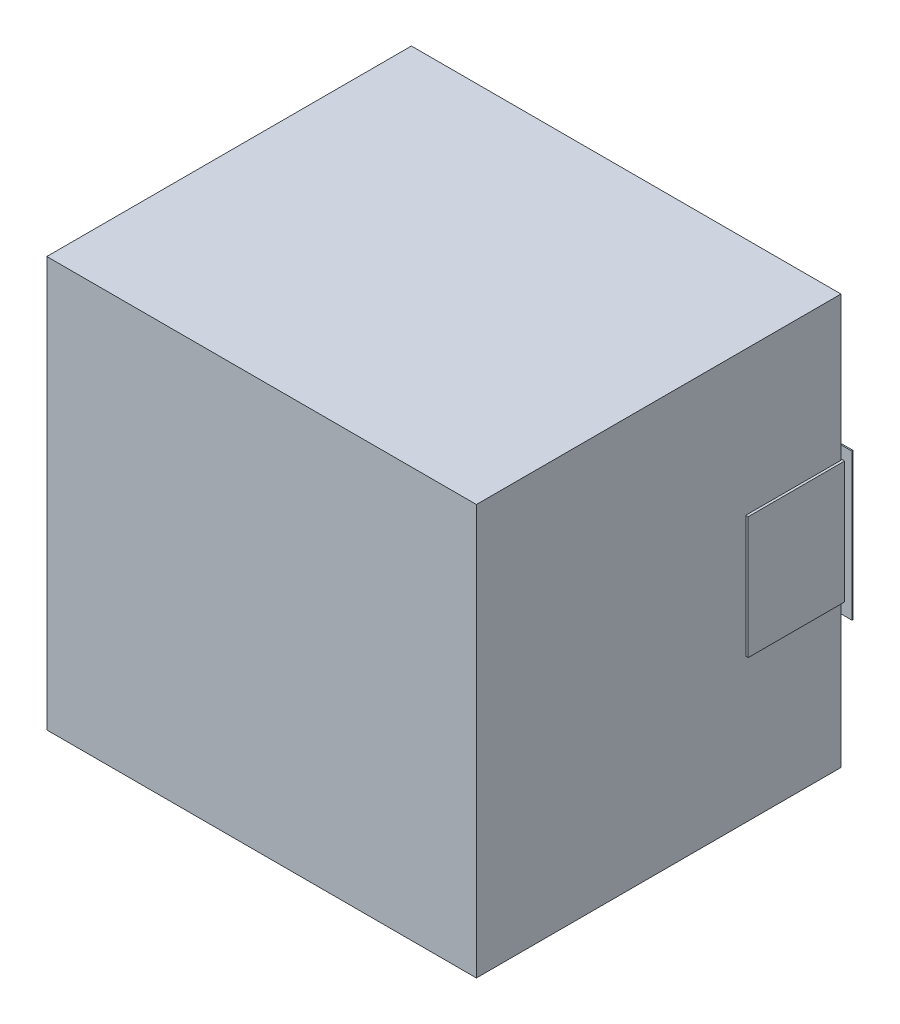
ISO-10303-21;
HEADER;
FILE_DESCRIPTION(('STEP AP214'),'2;1');
FILE_NAME('part.step','',(''),(''),'','','');
FILE_SCHEMA(('AUTOMOTIVE_DESIGN { 1 0 10303 214 1 1 1 1 }'));
ENDSEC;
DATA;
#1=APPLICATION_CONTEXT('core data for automotive mechanical design processes');
#2=APPLICATION_PROTOCOL_DEFINITION('international standard','automotive_design',2000,#1);
#3=PRODUCT_CONTEXT('',#1,'mechanical');
#4=PRODUCT('Part','Part','',(#3));
#5=PRODUCT_RELATED_PRODUCT_CATEGORY('part','',(#4));
#6=PRODUCT_DEFINITION_FORMATION('','',#4);
#7=PRODUCT_DEFINITION_CONTEXT('part definition',#1,'design');
#8=PRODUCT_DEFINITION('design','',#6,#7);
#9=PRODUCT_DEFINITION_SHAPE('','',#8);
#10=(LENGTH_UNIT() NAMED_UNIT(*) SI_UNIT(.MILLI.,.METRE.));
#11=(NAMED_UNIT(*) PLANE_ANGLE_UNIT() SI_UNIT($,.RADIAN.));
#12=(NAMED_UNIT(*) SI_UNIT($,.STERADIAN.) SOLID_ANGLE_UNIT());
#13=UNCERTAINTY_MEASURE_WITH_UNIT(LENGTH_MEASURE(1.E-05),#10,'distance_accuracy_value','');
#14=(GEOMETRIC_REPRESENTATION_CONTEXT(3) GLOBAL_UNCERTAINTY_ASSIGNED_CONTEXT((#13)) GLOBAL_UNIT_ASSIGNED_CONTEXT((#10,
#11,#12)) REPRESENTATION_CONTEXT('',''));
#15=CARTESIAN_POINT('',(0.,0.,0.));
#16=DIRECTION('',(0.,0.,1.));
#17=DIRECTION('',(1.,0.,0.));
#18=AXIS2_PLACEMENT_3D('',#15,#16,#17);
#19=CARTESIAN_POINT('',(0.,0.,0.0762));
#20=DIRECTION('',(0.,0.,-1.));
#21=DIRECTION('',(-1.,0.,0.));
#22=AXIS2_PLACEMENT_3D('',#19,#20,#21);
#23=PLANE('',#22);
#24=DIRECTION('',(1.,0.,0.));
#25=VECTOR('',#24,1.);
#26=CARTESIAN_POINT('',(-2.20000000000009,-1.5000000000001,0.0762));
#27=LINE('',#26,#25);
#28=CARTESIAN_POINT('',(-4.59999999999938,-1.5000000000001,0.0762));
#29=VERTEX_POINT('',#28);
#30=CARTESIAN_POINT('',(-2.20000000000009,-1.5000000000001,0.0762));
#31=VERTEX_POINT('',#30);
#32=EDGE_CURVE('E180',#29,#31,#27,.T.);
#33=ORIENTED_EDGE('',*,*,#32,.F.);
#34=DIRECTION('',(0.,1.,0.));
#35=VECTOR('',#34,1.);
#36=CARTESIAN_POINT('',(-4.59999999999938,-1.5000000000001,0.0762));
#37=LINE('',#36,#35);
#38=CARTESIAN_POINT('',(-4.59999999999938,1.5000000000001,0.0762));
#39=VERTEX_POINT('',#38);
#40=EDGE_CURVE('E20',#39,#29,#37,.F.);
#41=ORIENTED_EDGE('',*,*,#40,.F.);
#42=DIRECTION('',(1.,0.,0.));
#43=VECTOR('',#42,1.);
#44=CARTESIAN_POINT('',(-4.59999999999938,1.5000000000001,0.0762));
#45=LINE('',#44,#43);
#46=CARTESIAN_POINT('',(-2.20000000000009,1.5000000000001,0.0762));
#47=VERTEX_POINT('',#46);
#48=EDGE_CURVE('E175',#47,#39,#45,.F.);
#49=ORIENTED_EDGE('',*,*,#48,.F.);
#50=DIRECTION('',(0.,1.,0.));
#51=VECTOR('',#50,1.);
#52=CARTESIAN_POINT('',(-2.20000000000009,1.5000000000001,0.0762));
#53=LINE('',#52,#51);
#54=EDGE_CURVE('E195',#31,#47,#53,.T.);
#55=ORIENTED_EDGE('',*,*,#54,.F.);
#56=EDGE_LOOP('',(#33,#41,#49,#55));
#57=FACE_BOUND('',#56,.T.);
#58=ADVANCED_FACE('F17',(#57),#23,.T.);
#59=CARTESIAN_POINT('',(0.,0.,0.0762));
#60=DIRECTION('',(0.,0.,-1.));
#61=DIRECTION('',(-1.,0.,0.));
#62=AXIS2_PLACEMENT_3D('',#59,#60,#61);
#63=PLANE('',#62);
#64=DIRECTION('',(1.,0.,0.));
#65=VECTOR('',#64,1.);
#66=CARTESIAN_POINT('',(4.59999999999938,-1.5000000000001,0.0762));
#67=LINE('',#66,#65);
#68=CARTESIAN_POINT('',(2.20000000000009,-1.5000000000001,0.0762));
#69=VERTEX_POINT('',#68);
#70=CARTESIAN_POINT('',(4.59999999999938,-1.5000000000001,0.0762));
#71=VERTEX_POINT('',#70);
#72=EDGE_CURVE('E225',#69,#71,#67,.T.);
#73=ORIENTED_EDGE('',*,*,#72,.F.);
#74=DIRECTION('',(0.,1.,0.));
#75=VECTOR('',#74,1.);
#76=CARTESIAN_POINT('',(2.20000000000009,-1.5000000000001,0.0762));
#77=LINE('',#76,#75);
#78=CARTESIAN_POINT('',(2.20000000000009,1.5000000000001,0.0762));
#79=VERTEX_POINT('',#78);
#80=EDGE_CURVE('E205',#79,#69,#77,.F.);
#81=ORIENTED_EDGE('',*,*,#80,.F.);
#82=DIRECTION('',(1.,0.,0.));
#83=VECTOR('',#82,1.);
#84=CARTESIAN_POINT('',(2.20000000000009,1.5000000000001,0.0762));
#85=LINE('',#84,#83);
#86=CARTESIAN_POINT('',(4.59999999999938,1.5000000000001,0.0762));
#87=VERTEX_POINT('',#86);
#88=EDGE_CURVE('E210',#87,#79,#85,.F.);
#89=ORIENTED_EDGE('',*,*,#88,.F.);
#90=DIRECTION('',(0.,1.,0.));
#91=VECTOR('',#90,1.);
#92=CARTESIAN_POINT('',(4.59999999999938,1.5000000000001,0.0762));
#93=LINE('',#92,#91);
#94=EDGE_CURVE('E216',#71,#87,#93,.T.);
#95=ORIENTED_EDGE('',*,*,#94,.F.);
#96=EDGE_LOOP('',(#73,#81,#89,#95));
#97=FACE_BOUND('',#96,.T.);
#98=ADVANCED_FACE('F505',(#97),#63,.T.);
#99=CARTESIAN_POINT('',(-4.59999999999938,-1.5000000000001,0.0762));
#100=DIRECTION('',(-1.,0.,0.));
#101=DIRECTION('',(0.,0.,1.));
#102=AXIS2_PLACEMENT_3D('',#99,#100,#101);
#103=PLANE('',#102);
#104=DIRECTION('',(0.,0.,1.));
#105=VECTOR('',#104,1.);
#106=CARTESIAN_POINT('',(-4.59999999999938,1.5000000000001,0.0762));
#107=LINE('',#106,#105);
#108=CARTESIAN_POINT('',(-4.59999999999938,1.5000000000001,0.101200000000002));
#109=VERTEX_POINT('',#108);
#110=EDGE_CURVE('E183',#39,#109,#107,.T.);
#111=ORIENTED_EDGE('',*,*,#110,.F.);
#112=ORIENTED_EDGE('',*,*,#40,.T.);
#113=DIRECTION('',(0.,0.,-1.));
#114=VECTOR('',#113,1.);
#115=CARTESIAN_POINT('',(-4.59999999999938,-1.5000000000001,0.0762));
#116=LINE('',#115,#114);
#117=CARTESIAN_POINT('',(-4.59999999999938,-1.5000000000001,0.101200000000002));
#118=VERTEX_POINT('',#117);
#119=EDGE_CURVE('E202',#118,#29,#116,.T.);
#120=ORIENTED_EDGE('',*,*,#119,.F.);
#121=DIRECTION('',(0.,1.,0.));
#122=VECTOR('',#121,1.);
#123=CARTESIAN_POINT('',(-4.59999999999938,0.,0.101200000000002));
#124=LINE('',#123,#122);
#125=EDGE_CURVE('E187',#118,#109,#124,.T.);
#126=ORIENTED_EDGE('',*,*,#125,.T.);
#127=EDGE_LOOP('',(#111,#112,#120,#126));
#128=FACE_BOUND('',#127,.T.);
#129=ADVANCED_FACE('F185',(#128),#103,.T.);
#130=CARTESIAN_POINT('',(-4.59999999999938,1.5000000000001,0.0762));
#131=DIRECTION('',(0.,1.,0.));
#132=DIRECTION('',(0.,0.,1.));
#133=AXIS2_PLACEMENT_3D('',#130,#131,#132);
#134=PLANE('',#133);
#135=DIRECTION('',(0.,0.,-1.));
#136=VECTOR('',#135,1.);
#137=CARTESIAN_POINT('',(-2.20000000000009,1.5000000000001,0.0762));
#138=LINE('',#137,#136);
#139=CARTESIAN_POINT('',(-2.20000000000009,1.5000000000001,0.101200000000002));
#140=VERTEX_POINT('',#139);
#141=EDGE_CURVE('E192',#47,#140,#138,.F.);
#142=ORIENTED_EDGE('',*,*,#141,.F.);
#143=ORIENTED_EDGE('',*,*,#48,.T.);
#144=ORIENTED_EDGE('',*,*,#110,.T.);
#145=DIRECTION('',(-1.,0.,0.));
#146=VECTOR('',#145,1.);
#147=CARTESIAN_POINT('',(0.,1.5000000000001,0.101200000000002));
#148=LINE('',#147,#146);
#149=EDGE_CURVE('E229',#109,#140,#148,.F.);
#150=ORIENTED_EDGE('',*,*,#149,.T.);
#151=EDGE_LOOP('',(#142,#143,#144,#150));
#152=FACE_BOUND('',#151,.T.);
#153=ADVANCED_FACE('F190',(#152),#134,.T.);
#154=CARTESIAN_POINT('',(-2.20000000000009,1.5000000000001,0.0762));
#155=DIRECTION('',(1.,0.,0.));
#156=DIRECTION('',(0.,0.,-1.));
#157=AXIS2_PLACEMENT_3D('',#154,#155,#156);
#158=PLANE('',#157);
#159=DIRECTION('',(0.,0.,-1.));
#160=VECTOR('',#159,1.);
#161=CARTESIAN_POINT('',(-2.20000000000009,-1.5000000000001,0.0762));
#162=LINE('',#161,#160);
#163=CARTESIAN_POINT('',(-2.20000000000009,-1.5000000000001,0.101200000000002));
#164=VERTEX_POINT('',#163);
#165=EDGE_CURVE('E199',#31,#164,#162,.F.);
#166=ORIENTED_EDGE('',*,*,#165,.F.);
#167=ORIENTED_EDGE('',*,*,#54,.T.);
#168=ORIENTED_EDGE('',*,*,#141,.T.);
#169=DIRECTION('',(0.,1.,0.));
#170=VECTOR('',#169,1.);
#171=CARTESIAN_POINT('',(-2.20000000000009,0.,0.101200000000002));
#172=LINE('',#171,#170);
#173=EDGE_CURVE('E231',#140,#164,#172,.F.);
#174=ORIENTED_EDGE('',*,*,#173,.T.);
#175=EDGE_LOOP('',(#166,#167,#168,#174));
#176=FACE_BOUND('',#175,.T.);
#177=ADVANCED_FACE('F431',(#176),#158,.T.);
#178=CARTESIAN_POINT('',(-2.20000000000009,-1.5000000000001,0.0762));
#179=DIRECTION('',(0.,-1.,0.));
#180=DIRECTION('',(0.,0.,-1.));
#181=AXIS2_PLACEMENT_3D('',#178,#179,#180);
#182=PLANE('',#181);
#183=ORIENTED_EDGE('',*,*,#119,.T.);
#184=ORIENTED_EDGE('',*,*,#32,.T.);
#185=ORIENTED_EDGE('',*,*,#165,.T.);
#186=DIRECTION('',(-1.,0.,0.));
#187=VECTOR('',#186,1.);
#188=CARTESIAN_POINT('',(0.,-1.5000000000001,0.101200000000002));
#189=LINE('',#188,#187);
#190=EDGE_CURVE('E233',#164,#118,#189,.T.);
#191=ORIENTED_EDGE('',*,*,#190,.T.);
#192=EDGE_LOOP('',(#183,#184,#185,#191));
#193=FACE_BOUND('',#192,.T.);
#194=ADVANCED_FACE('F433',(#193),#182,.T.);
#195=CARTESIAN_POINT('',(2.20000000000009,-1.5000000000001,0.0762));
#196=DIRECTION('',(-1.,0.,0.));
#197=DIRECTION('',(0.,0.,1.));
#198=AXIS2_PLACEMENT_3D('',#195,#196,#197);
#199=PLANE('',#198);
#200=DIRECTION('',(0.,0.,1.));
#201=VECTOR('',#200,1.);
#202=CARTESIAN_POINT('',(2.20000000000009,1.5000000000001,0.0762));
#203=LINE('',#202,#201);
#204=CARTESIAN_POINT('',(2.20000000000009,1.5000000000001,0.101200000000002));
#205=VERTEX_POINT('',#204);
#206=EDGE_CURVE('E207',#79,#205,#203,.T.);
#207=ORIENTED_EDGE('',*,*,#206,.F.);
#208=ORIENTED_EDGE('',*,*,#80,.T.);
#209=DIRECTION('',(0.,0.,-1.));
#210=VECTOR('',#209,1.);
#211=CARTESIAN_POINT('',(2.20000000000009,-1.5000000000001,0.0762));
#212=LINE('',#211,#210);
#213=CARTESIAN_POINT('',(2.20000000000009,-1.5000000000001,0.101200000000002));
#214=VERTEX_POINT('',#213);
#215=EDGE_CURVE('E222',#214,#69,#212,.T.);
#216=ORIENTED_EDGE('',*,*,#215,.F.);
#217=DIRECTION('',(0.,1.,0.));
#218=VECTOR('',#217,1.);
#219=CARTESIAN_POINT('',(2.20000000000009,0.,0.101200000000002));
#220=LINE('',#219,#218);
#221=EDGE_CURVE('E240',#214,#205,#220,.T.);
#222=ORIENTED_EDGE('',*,*,#221,.T.);
#223=EDGE_LOOP('',(#207,#208,#216,#222));
#224=FACE_BOUND('',#223,.T.);
#225=ADVANCED_FACE('F435',(#224),#199,.T.);
#226=CARTESIAN_POINT('',(2.20000000000009,1.5000000000001,0.0762));
#227=DIRECTION('',(0.,1.,0.));
#228=DIRECTION('',(0.,0.,1.));
#229=AXIS2_PLACEMENT_3D('',#226,#227,#228);
#230=PLANE('',#229);
#231=DIRECTION('',(0.,0.,-1.));
#232=VECTOR('',#231,1.);
#233=CARTESIAN_POINT('',(4.59999999999938,1.5000000000001,0.0762));
#234=LINE('',#233,#232);
#235=CARTESIAN_POINT('',(4.59999999999938,1.5000000000001,0.101200000000002));
#236=VERTEX_POINT('',#235);
#237=EDGE_CURVE('E213',#87,#236,#234,.F.);
#238=ORIENTED_EDGE('',*,*,#237,.F.);
#239=ORIENTED_EDGE('',*,*,#88,.T.);
#240=ORIENTED_EDGE('',*,*,#206,.T.);
#241=DIRECTION('',(-1.,0.,0.));
#242=VECTOR('',#241,1.);
#243=CARTESIAN_POINT('',(0.,1.5000000000001,0.101200000000002));
#244=LINE('',#243,#242);
#245=EDGE_CURVE('E242',#205,#236,#244,.F.);
#246=ORIENTED_EDGE('',*,*,#245,.T.);
#247=EDGE_LOOP('',(#238,#239,#240,#246));
#248=FACE_BOUND('',#247,.T.);
#249=ADVANCED_FACE('F442',(#248),#230,.T.);
#250=CARTESIAN_POINT('',(4.59999999999938,1.5000000000001,0.0762));
#251=DIRECTION('',(1.,0.,0.));
#252=DIRECTION('',(0.,0.,-1.));
#253=AXIS2_PLACEMENT_3D('',#250,#251,#252);
#254=PLANE('',#253);
#255=DIRECTION('',(0.,0.,-1.));
#256=VECTOR('',#255,1.);
#257=CARTESIAN_POINT('',(4.59999999999938,-1.5000000000001,0.0762));
#258=LINE('',#257,#256);
#259=CARTESIAN_POINT('',(4.59999999999938,-1.5000000000001,0.101200000000002));
#260=VERTEX_POINT('',#259);
#261=EDGE_CURVE('E219',#71,#260,#258,.F.);
#262=ORIENTED_EDGE('',*,*,#261,.F.);
#263=ORIENTED_EDGE('',*,*,#94,.T.);
#264=ORIENTED_EDGE('',*,*,#237,.T.);
#265=DIRECTION('',(0.,1.,0.));
#266=VECTOR('',#265,1.);
#267=CARTESIAN_POINT('',(4.59999999999938,0.,0.101200000000002));
#268=LINE('',#267,#266);
#269=EDGE_CURVE('E244',#236,#260,#268,.F.);
#270=ORIENTED_EDGE('',*,*,#269,.T.);
#271=EDGE_LOOP('',(#262,#263,#264,#270));
#272=FACE_BOUND('',#271,.T.);
#273=ADVANCED_FACE('F490',(#272),#254,.T.);
#274=CARTESIAN_POINT('',(4.59999999999938,-1.5000000000001,0.0762));
#275=DIRECTION('',(0.,-1.,0.));
#276=DIRECTION('',(0.,0.,-1.));
#277=AXIS2_PLACEMENT_3D('',#274,#275,#276);
#278=PLANE('',#277);
#279=ORIENTED_EDGE('',*,*,#215,.T.);
#280=ORIENTED_EDGE('',*,*,#72,.T.);
#281=ORIENTED_EDGE('',*,*,#261,.T.);
#282=DIRECTION('',(-1.,0.,0.));
#283=VECTOR('',#282,1.);
#284=CARTESIAN_POINT('',(0.,-1.5000000000001,0.101200000000002));
#285=LINE('',#284,#283);
#286=EDGE_CURVE('E246',#260,#214,#285,.T.);
#287=ORIENTED_EDGE('',*,*,#286,.T.);
#288=EDGE_LOOP('',(#279,#280,#281,#287));
#289=FACE_BOUND('',#288,.T.);
#290=ADVANCED_FACE('F425',(#289),#278,.T.);
#291=CARTESIAN_POINT('',(0.,0.,0.101200000000002));
#292=DIRECTION('',(0.,0.,-1.));
#293=DIRECTION('',(-1.,0.,0.));
#294=AXIS2_PLACEMENT_3D('',#291,#292,#293);
#295=PLANE('',#294);
#296=DIRECTION('',(0.,1.,0.));
#297=VECTOR('',#296,1.);
#298=CARTESIAN_POINT('',(-2.74999999999916,1.25000000000008,0.101200000000002));
#299=LINE('',#298,#297);
#300=CARTESIAN_POINT('',(-2.74999999999916,-1.25000000000008,0.101200000000002));
#301=VERTEX_POINT('',#300);
#302=CARTESIAN_POINT('',(-2.74999999999916,1.25000000000008,0.101200000000002));
#303=VERTEX_POINT('',#302);
#304=EDGE_CURVE('E259',#301,#303,#299,.T.);
#305=ORIENTED_EDGE('',*,*,#304,.F.);
#306=DIRECTION('',(-1.,0.,0.));
#307=VECTOR('',#306,1.);
#308=CARTESIAN_POINT('',(0.,-1.25000000000008,0.101200000000002));
#309=LINE('',#308,#307);
#310=CARTESIAN_POINT('',(-4.44999999999998,-1.25000000000008,0.101200000000002));
#311=VERTEX_POINT('',#310);
#312=EDGE_CURVE('E236',#311,#301,#309,.F.);
#313=ORIENTED_EDGE('',*,*,#312,.F.);
#314=DIRECTION('',(0.,1.,0.));
#315=VECTOR('',#314,1.);
#316=CARTESIAN_POINT('',(-4.44999999999998,-1.25000000000008,0.101200000000002));
#317=LINE('',#316,#315);
#318=CARTESIAN_POINT('',(-4.44999999999998,1.25000000000008,0.101200000000002));
#319=VERTEX_POINT('',#318);
#320=EDGE_CURVE('E253',#319,#311,#317,.F.);
#321=ORIENTED_EDGE('',*,*,#320,.F.);
#322=DIRECTION('',(-1.,0.,0.));
#323=VECTOR('',#322,1.);
#324=CARTESIAN_POINT('',(0.,1.25000000000008,0.101200000000002));
#325=LINE('',#324,#323);
#326=EDGE_CURVE('E238',#303,#319,#325,.T.);
#327=ORIENTED_EDGE('',*,*,#326,.F.);
#328=EDGE_LOOP('',(#305,#313,#321,#327));
#329=FACE_BOUND('',#328,.T.);
#330=ORIENTED_EDGE('',*,*,#173,.F.);
#331=ORIENTED_EDGE('',*,*,#149,.F.);
#332=ORIENTED_EDGE('',*,*,#125,.F.);
#333=ORIENTED_EDGE('',*,*,#190,.F.);
#334=EDGE_LOOP('',(#330,#331,#332,#333));
#335=FACE_BOUND('',#334,.T.);
#336=ADVANCED_FACE('F421',(#329,#335),#295,.F.);
#337=CARTESIAN_POINT('',(0.,0.,0.101200000000002));
#338=DIRECTION('',(0.,0.,-1.));
#339=DIRECTION('',(-1.,0.,0.));
#340=AXIS2_PLACEMENT_3D('',#337,#338,#339);
#341=PLANE('',#340);
#342=DIRECTION('',(-1.,0.,0.));
#343=VECTOR('',#342,1.);
#344=CARTESIAN_POINT('',(0.,1.25000000000008,0.101200000000002));
#345=LINE('',#344,#343);
#346=CARTESIAN_POINT('',(4.44999999999998,1.25000000000008,0.101200000000002));
#347=VERTEX_POINT('',#346);
#348=CARTESIAN_POINT('',(2.74999999999916,1.25000000000008,0.101200000000002));
#349=VERTEX_POINT('',#348);
#350=EDGE_CURVE('E251',#347,#349,#345,.T.);
#351=ORIENTED_EDGE('',*,*,#350,.F.);
#352=DIRECTION('',(0.,1.,0.));
#353=VECTOR('',#352,1.);
#354=CARTESIAN_POINT('',(4.44999999999998,1.25000000000008,0.101200000000002));
#355=LINE('',#354,#353);
#356=CARTESIAN_POINT('',(4.44999999999998,-1.25000000000008,0.101200000000002));
#357=VERTEX_POINT('',#356);
#358=EDGE_CURVE('E256',#357,#347,#355,.T.);
#359=ORIENTED_EDGE('',*,*,#358,.F.);
#360=DIRECTION('',(-1.,0.,0.));
#361=VECTOR('',#360,1.);
#362=CARTESIAN_POINT('',(0.,-1.25000000000008,0.101200000000002));
#363=LINE('',#362,#361);
#364=CARTESIAN_POINT('',(2.74999999999916,-1.25000000000008,0.101200000000002));
#365=VERTEX_POINT('',#364);
#366=EDGE_CURVE('E249',#365,#357,#363,.F.);
#367=ORIENTED_EDGE('',*,*,#366,.F.);
#368=DIRECTION('',(0.,1.,0.));
#369=VECTOR('',#368,1.);
#370=CARTESIAN_POINT('',(2.74999999999916,-1.25000000000008,0.101200000000002));
#371=LINE('',#370,#369);
#372=EDGE_CURVE('E262',#349,#365,#371,.F.);
#373=ORIENTED_EDGE('',*,*,#372,.F.);
#374=EDGE_LOOP('',(#351,#359,#367,#373));
#375=FACE_BOUND('',#374,.T.);
#376=ORIENTED_EDGE('',*,*,#269,.F.);
#377=ORIENTED_EDGE('',*,*,#245,.F.);
#378=ORIENTED_EDGE('',*,*,#221,.F.);
#379=ORIENTED_EDGE('',*,*,#286,.F.);
#380=EDGE_LOOP('',(#376,#377,#378,#379));
#381=FACE_BOUND('',#380,.T.);
#382=ADVANCED_FACE('F424',(#375,#381),#341,.F.);
#383=CARTESIAN_POINT('',(-4.44999999999998,-1.25000000000008,0.0762));
#384=DIRECTION('',(-1.,0.,0.));
#385=DIRECTION('',(0.,0.,1.));
#386=AXIS2_PLACEMENT_3D('',#383,#384,#385);
#387=PLANE('',#386);
#388=DIRECTION('',(0.,0.,1.));
#389=VECTOR('',#388,1.);
#390=CARTESIAN_POINT('',(-4.44999999999998,1.25000000000008,0.0762));
#391=LINE('',#390,#389);
#392=CARTESIAN_POINT('',(-4.44999999999998,1.25000000000008,2.07619999999987));
#393=VERTEX_POINT('',#392);
#394=EDGE_CURVE('E271',#319,#393,#391,.T.);
#395=ORIENTED_EDGE('',*,*,#394,.F.);
#396=ORIENTED_EDGE('',*,*,#320,.T.);
#397=DIRECTION('',(0.,0.,-1.));
#398=VECTOR('',#397,1.);
#399=CARTESIAN_POINT('',(-4.44999999999998,-1.25000000000008,0.0762));
#400=LINE('',#399,#398);
#401=CARTESIAN_POINT('',(-4.44999999999998,-1.25000000000008,2.07619999999987));
#402=VERTEX_POINT('',#401);
#403=EDGE_CURVE('E268',#402,#311,#400,.T.);
#404=ORIENTED_EDGE('',*,*,#403,.F.);
#405=DIRECTION('',(0.,1.,0.));
#406=VECTOR('',#405,1.);
#407=CARTESIAN_POINT('',(-4.44999999999998,0.,2.07619999999987));
#408=LINE('',#407,#406);
#409=EDGE_CURVE('E280',#402,#393,#408,.T.);
#410=ORIENTED_EDGE('',*,*,#409,.T.);
#411=EDGE_LOOP('',(#395,#396,#404,#410));
#412=FACE_BOUND('',#411,.T.);
#413=ADVANCED_FACE('F418',(#412),#387,.T.);
#414=CARTESIAN_POINT('',(4.44999999999998,1.25000000000008,0.0762));
#415=DIRECTION('',(1.,0.,0.));
#416=DIRECTION('',(0.,0.,-1.));
#417=AXIS2_PLACEMENT_3D('',#414,#415,#416);
#418=PLANE('',#417);
#419=DIRECTION('',(0.,0.,-1.));
#420=VECTOR('',#419,1.);
#421=CARTESIAN_POINT('',(4.44999999999998,-1.25000000000008,0.0762));
#422=LINE('',#421,#420);
#423=CARTESIAN_POINT('',(4.44999999999998,-1.25000000000008,2.07619999999987));
#424=VERTEX_POINT('',#423);
#425=EDGE_CURVE('E290',#357,#424,#422,.F.);
#426=ORIENTED_EDGE('',*,*,#425,.F.);
#427=ORIENTED_EDGE('',*,*,#358,.T.);
#428=DIRECTION('',(0.,0.,1.));
#429=VECTOR('',#428,1.);
#430=CARTESIAN_POINT('',(4.44999999999998,1.25000000000008,0.0762));
#431=LINE('',#430,#429);
#432=CARTESIAN_POINT('',(4.44999999999998,1.25000000000008,2.07619999999987));
#433=VERTEX_POINT('',#432);
#434=EDGE_CURVE('E287',#433,#347,#431,.F.);
#435=ORIENTED_EDGE('',*,*,#434,.F.);
#436=DIRECTION('',(0.,1.,0.));
#437=VECTOR('',#436,1.);
#438=CARTESIAN_POINT('',(4.44999999999998,0.,2.07619999999987));
#439=LINE('',#438,#437);
#440=EDGE_CURVE('E299',#433,#424,#439,.F.);
#441=ORIENTED_EDGE('',*,*,#440,.T.);
#442=EDGE_LOOP('',(#426,#427,#435,#441));
#443=FACE_BOUND('',#442,.T.);
#444=ADVANCED_FACE('F479',(#443),#418,.T.);
#445=CARTESIAN_POINT('',(-2.74999999999916,1.25000000000008,0.0762));
#446=DIRECTION('',(1.,0.,0.));
#447=DIRECTION('',(0.,0.,-1.));
#448=AXIS2_PLACEMENT_3D('',#445,#446,#447);
#449=PLANE('',#448);
#450=DIRECTION('',(0.,0.,-1.));
#451=VECTOR('',#450,1.);
#452=CARTESIAN_POINT('',(-2.74999999999916,-1.25000000000008,0.0762));
#453=LINE('',#452,#451);
#454=CARTESIAN_POINT('',(-2.74999999999916,-1.25000000000008,0.126200000000003));
#455=VERTEX_POINT('',#454);
#456=EDGE_CURVE('E265',#301,#455,#453,.F.);
#457=ORIENTED_EDGE('',*,*,#456,.F.);
#458=ORIENTED_EDGE('',*,*,#304,.T.);
#459=DIRECTION('',(0.,0.,1.));
#460=VECTOR('',#459,1.);
#461=CARTESIAN_POINT('',(-2.74999999999916,1.25000000000008,0.0762));
#462=LINE('',#461,#460);
#463=CARTESIAN_POINT('',(-2.74999999999916,1.25000000000008,0.126200000000003));
#464=VERTEX_POINT('',#463);
#465=EDGE_CURVE('E274',#464,#303,#462,.F.);
#466=ORIENTED_EDGE('',*,*,#465,.F.);
#467=DIRECTION('',(0.,1.,0.));
#468=VECTOR('',#467,1.);
#469=CARTESIAN_POINT('',(-2.74999999999916,0.,0.126200000000003));
#470=LINE('',#469,#468);
#471=EDGE_CURVE('E306',#464,#455,#470,.F.);
#472=ORIENTED_EDGE('',*,*,#471,.T.);
#473=EDGE_LOOP('',(#457,#458,#466,#472));
#474=FACE_BOUND('',#473,.T.);
#475=ADVANCED_FACE('F407',(#474),#449,.T.);
#476=CARTESIAN_POINT('',(2.74999999999916,-1.25000000000008,0.0762));
#477=DIRECTION('',(-1.,0.,0.));
#478=DIRECTION('',(0.,0.,1.));
#479=AXIS2_PLACEMENT_3D('',#476,#477,#478);
#480=PLANE('',#479);
#481=DIRECTION('',(0.,0.,1.));
#482=VECTOR('',#481,1.);
#483=CARTESIAN_POINT('',(2.74999999999916,1.25000000000008,0.0762));
#484=LINE('',#483,#482);
#485=CARTESIAN_POINT('',(2.74999999999916,1.25000000000008,0.126200000000003));
#486=VERTEX_POINT('',#485);
#487=EDGE_CURVE('E284',#349,#486,#484,.T.);
#488=ORIENTED_EDGE('',*,*,#487,.F.);
#489=ORIENTED_EDGE('',*,*,#372,.T.);
#490=DIRECTION('',(0.,0.,-1.));
#491=VECTOR('',#490,1.);
#492=CARTESIAN_POINT('',(2.74999999999916,-1.25000000000008,0.0762));
#493=LINE('',#492,#491);
#494=CARTESIAN_POINT('',(2.74999999999916,-1.25000000000008,0.126200000000003));
#495=VERTEX_POINT('',#494);
#496=EDGE_CURVE('E293',#495,#365,#493,.T.);
#497=ORIENTED_EDGE('',*,*,#496,.F.);
#498=DIRECTION('',(0.,1.,0.));
#499=VECTOR('',#498,1.);
#500=CARTESIAN_POINT('',(2.74999999999916,0.,0.126200000000003));
#501=LINE('',#500,#499);
#502=EDGE_CURVE('E313',#495,#486,#501,.T.);
#503=ORIENTED_EDGE('',*,*,#502,.T.);
#504=EDGE_LOOP('',(#488,#489,#497,#503));
#505=FACE_BOUND('',#504,.T.);
#506=ADVANCED_FACE('F473',(#505),#480,.T.);
#507=CARTESIAN_POINT('',(-2.74999999999916,-1.25000000000008,0.0762));
#508=DIRECTION('',(0.,-1.,0.));
#509=DIRECTION('',(0.,0.,-1.));
#510=AXIS2_PLACEMENT_3D('',#507,#508,#509);
#511=PLANE('',#510);
#512=ORIENTED_EDGE('',*,*,#403,.T.);
#513=ORIENTED_EDGE('',*,*,#312,.T.);
#514=ORIENTED_EDGE('',*,*,#456,.T.);
#515=DIRECTION('',(1.,0.,0.));
#516=VECTOR('',#515,1.);
#517=CARTESIAN_POINT('',(0.,-1.25000000000008,0.126200000000003));
#518=LINE('',#517,#516);
#519=CARTESIAN_POINT('',(-4.40000000000018,-1.25000000000008,0.126200000000003));
#520=VERTEX_POINT('',#519);
#521=EDGE_CURVE('E308',#455,#520,#518,.F.);
#522=ORIENTED_EDGE('',*,*,#521,.T.);
#523=DIRECTION('',(0.,0.,1.));
#524=VECTOR('',#523,1.);
#525=CARTESIAN_POINT('',(-4.40000000000018,-1.25000000000008,0.0762));
#526=LINE('',#525,#524);
#527=CARTESIAN_POINT('',(-4.40000000000018,-1.25000000000008,2.07619999999987));
#528=VERTEX_POINT('',#527);
#529=EDGE_CURVE('E317',#528,#520,#526,.F.);
#530=ORIENTED_EDGE('',*,*,#529,.F.);
#531=DIRECTION('',(-1.,0.,0.));
#532=VECTOR('',#531,1.);
#533=CARTESIAN_POINT('',(0.,-1.25000000000008,2.07619999999987));
#534=LINE('',#533,#532);
#535=EDGE_CURVE('E277',#528,#402,#534,.T.);
#536=ORIENTED_EDGE('',*,*,#535,.T.);
#537=EDGE_LOOP('',(#512,#513,#514,#522,#530,#536));
#538=FACE_BOUND('',#537,.T.);
#539=ADVANCED_FACE('F402',(#538),#511,.T.);
#540=CARTESIAN_POINT('',(-4.44999999999998,1.25000000000008,0.0762));
#541=DIRECTION('',(0.,1.,0.));
#542=DIRECTION('',(0.,0.,1.));
#543=AXIS2_PLACEMENT_3D('',#540,#541,#542);
#544=PLANE('',#543);
#545=ORIENTED_EDGE('',*,*,#465,.T.);
#546=ORIENTED_EDGE('',*,*,#326,.T.);
#547=ORIENTED_EDGE('',*,*,#394,.T.);
#548=DIRECTION('',(-1.,0.,0.));
#549=VECTOR('',#548,1.);
#550=CARTESIAN_POINT('',(0.,1.25000000000008,2.07619999999987));
#551=LINE('',#550,#549);
#552=CARTESIAN_POINT('',(-4.40000000000018,1.25000000000008,2.07619999999987));
#553=VERTEX_POINT('',#552);
#554=EDGE_CURVE('E282',#393,#553,#551,.F.);
#555=ORIENTED_EDGE('',*,*,#554,.T.);
#556=DIRECTION('',(0.,0.,1.));
#557=VECTOR('',#556,1.);
#558=CARTESIAN_POINT('',(-4.40000000000018,1.25000000000008,0.0762));
#559=LINE('',#558,#557);
#560=CARTESIAN_POINT('',(-4.40000000000018,1.25000000000008,0.126200000000003));
#561=VERTEX_POINT('',#560);
#562=EDGE_CURVE('E325',#561,#553,#559,.T.);
#563=ORIENTED_EDGE('',*,*,#562,.F.);
#564=DIRECTION('',(1.,0.,0.));
#565=VECTOR('',#564,1.);
#566=CARTESIAN_POINT('',(0.,1.25000000000008,0.126200000000003));
#567=LINE('',#566,#565);
#568=EDGE_CURVE('E303',#561,#464,#567,.T.);
#569=ORIENTED_EDGE('',*,*,#568,.T.);
#570=EDGE_LOOP('',(#545,#546,#547,#555,#563,#569));
#571=FACE_BOUND('',#570,.T.);
#572=ADVANCED_FACE('F410',(#571),#544,.T.);
#573=CARTESIAN_POINT('',(0.,0.,2.07619999999987));
#574=DIRECTION('',(0.,0.,-1.));
#575=DIRECTION('',(-1.,0.,0.));
#576=AXIS2_PLACEMENT_3D('',#573,#574,#575);
#577=PLANE('',#576);
#578=ORIENTED_EDGE('',*,*,#409,.F.);
#579=ORIENTED_EDGE('',*,*,#535,.F.);
#580=DIRECTION('',(0.,1.,0.));
#581=VECTOR('',#580,1.);
#582=CARTESIAN_POINT('',(-4.40000000000018,4.20000000000098,2.07619999999987));
#583=LINE('',#582,#581);
#584=EDGE_CURVE('E328',#553,#528,#583,.F.);
#585=ORIENTED_EDGE('',*,*,#584,.F.);
#586=ORIENTED_EDGE('',*,*,#554,.F.);
#587=EDGE_LOOP('',(#578,#579,#585,#586));
#588=FACE_BOUND('',#587,.T.);
#589=ADVANCED_FACE('F415',(#588),#577,.F.);
#590=CARTESIAN_POINT('',(2.74999999999916,1.25000000000008,0.0762));
#591=DIRECTION('',(0.,1.,0.));
#592=DIRECTION('',(0.,0.,1.));
#593=AXIS2_PLACEMENT_3D('',#590,#591,#592);
#594=PLANE('',#593);
#595=ORIENTED_EDGE('',*,*,#434,.T.);
#596=ORIENTED_EDGE('',*,*,#350,.T.);
#597=ORIENTED_EDGE('',*,*,#487,.T.);
#598=DIRECTION('',(1.,0.,0.));
#599=VECTOR('',#598,1.);
#600=CARTESIAN_POINT('',(0.,1.25000000000008,0.126200000000003));
#601=LINE('',#600,#599);
#602=CARTESIAN_POINT('',(4.40000000000018,1.25000000000008,0.126200000000003));
#603=VERTEX_POINT('',#602);
#604=EDGE_CURVE('E315',#486,#603,#601,.T.);
#605=ORIENTED_EDGE('',*,*,#604,.T.);
#606=DIRECTION('',(0.,0.,-1.));
#607=VECTOR('',#606,1.);
#608=CARTESIAN_POINT('',(4.40000000000018,1.25000000000008,0.0762));
#609=LINE('',#608,#607);
#610=CARTESIAN_POINT('',(4.40000000000018,1.25000000000008,2.07619999999987));
#611=VERTEX_POINT('',#610);
#612=EDGE_CURVE('E336',#611,#603,#609,.T.);
#613=ORIENTED_EDGE('',*,*,#612,.F.);
#614=DIRECTION('',(-1.,0.,0.));
#615=VECTOR('',#614,1.);
#616=CARTESIAN_POINT('',(0.,1.25000000000008,2.07619999999987));
#617=LINE('',#616,#615);
#618=EDGE_CURVE('E296',#611,#433,#617,.F.);
#619=ORIENTED_EDGE('',*,*,#618,.T.);
#620=EDGE_LOOP('',(#595,#596,#597,#605,#613,#619));
#621=FACE_BOUND('',#620,.T.);
#622=ADVANCED_FACE('F391',(#621),#594,.T.);
#623=CARTESIAN_POINT('',(4.44999999999998,-1.25000000000008,0.0762));
#624=DIRECTION('',(0.,-1.,0.));
#625=DIRECTION('',(0.,0.,-1.));
#626=AXIS2_PLACEMENT_3D('',#623,#624,#625);
#627=PLANE('',#626);
#628=ORIENTED_EDGE('',*,*,#496,.T.);
#629=ORIENTED_EDGE('',*,*,#366,.T.);
#630=ORIENTED_EDGE('',*,*,#425,.T.);
#631=DIRECTION('',(-1.,0.,0.));
#632=VECTOR('',#631,1.);
#633=CARTESIAN_POINT('',(0.,-1.25000000000008,2.07619999999987));
#634=LINE('',#633,#632);
#635=CARTESIAN_POINT('',(4.40000000000018,-1.25000000000008,2.07619999999987));
#636=VERTEX_POINT('',#635);
#637=EDGE_CURVE('E301',#424,#636,#634,.T.);
#638=ORIENTED_EDGE('',*,*,#637,.T.);
#639=DIRECTION('',(0.,0.,-1.));
#640=VECTOR('',#639,1.);
#641=CARTESIAN_POINT('',(4.40000000000018,-1.25000000000008,0.0762));
#642=LINE('',#641,#640);
#643=CARTESIAN_POINT('',(4.40000000000018,-1.25000000000008,0.126200000000003));
#644=VERTEX_POINT('',#643);
#645=EDGE_CURVE('E347',#644,#636,#642,.F.);
#646=ORIENTED_EDGE('',*,*,#645,.F.);
#647=DIRECTION('',(1.,0.,0.));
#648=VECTOR('',#647,1.);
#649=CARTESIAN_POINT('',(0.,-1.25000000000008,0.126200000000003));
#650=LINE('',#649,#648);
#651=EDGE_CURVE('E310',#644,#495,#650,.F.);
#652=ORIENTED_EDGE('',*,*,#651,.T.);
#653=EDGE_LOOP('',(#628,#629,#630,#638,#646,#652));
#654=FACE_BOUND('',#653,.T.);
#655=ADVANCED_FACE('F383',(#654),#627,.T.);
#656=CARTESIAN_POINT('',(0.,0.,2.07619999999987));
#657=DIRECTION('',(0.,0.,-1.));
#658=DIRECTION('',(-1.,0.,0.));
#659=AXIS2_PLACEMENT_3D('',#656,#657,#658);
#660=PLANE('',#659);
#661=ORIENTED_EDGE('',*,*,#440,.F.);
#662=ORIENTED_EDGE('',*,*,#618,.F.);
#663=DIRECTION('',(0.,1.,0.));
#664=VECTOR('',#663,1.);
#665=CARTESIAN_POINT('',(4.40000000000018,-4.20000000000098,2.07619999999987));
#666=LINE('',#665,#664);
#667=EDGE_CURVE('E350',#636,#611,#666,.T.);
#668=ORIENTED_EDGE('',*,*,#667,.F.);
#669=ORIENTED_EDGE('',*,*,#637,.F.);
#670=EDGE_LOOP('',(#661,#662,#668,#669));
#671=FACE_BOUND('',#670,.T.);
#672=ADVANCED_FACE('F389',(#671),#660,.F.);
#673=CARTESIAN_POINT('',(0.,0.,0.126200000000003));
#674=DIRECTION('',(0.,0.,1.));
#675=DIRECTION('',(1.,0.,0.));
#676=AXIS2_PLACEMENT_3D('',#673,#674,#675);
#677=PLANE('',#676);
#678=DIRECTION('',(1.,0.,0.));
#679=VECTOR('',#678,1.);
#680=CARTESIAN_POINT('',(4.40000000000018,4.20000000000098,0.126200000000003));
#681=LINE('',#680,#679);
#682=CARTESIAN_POINT('',(4.40000000000018,4.20000000000098,0.126200000000003));
#683=VERTEX_POINT('',#682);
#684=CARTESIAN_POINT('',(-4.40000000000018,4.20000000000098,0.126200000000003));
#685=VERTEX_POINT('',#684);
#686=EDGE_CURVE('E357',#683,#685,#681,.F.);
#687=ORIENTED_EDGE('',*,*,#686,.F.);
#688=DIRECTION('',(0.,1.,0.));
#689=VECTOR('',#688,1.);
#690=CARTESIAN_POINT('',(4.40000000000018,-4.20000000000098,0.126200000000003));
#691=LINE('',#690,#689);
#692=EDGE_CURVE('E339',#603,#683,#691,.T.);
#693=ORIENTED_EDGE('',*,*,#692,.F.);
#694=ORIENTED_EDGE('',*,*,#604,.F.);
#695=ORIENTED_EDGE('',*,*,#502,.F.);
#696=ORIENTED_EDGE('',*,*,#651,.F.);
#697=DIRECTION('',(0.,1.,0.));
#698=VECTOR('',#697,1.);
#699=CARTESIAN_POINT('',(4.40000000000018,-4.20000000000098,0.126200000000003));
#700=LINE('',#699,#698);
#701=CARTESIAN_POINT('',(4.40000000000018,-4.20000000000098,0.126200000000003));
#702=VERTEX_POINT('',#701);
#703=EDGE_CURVE('E344',#702,#644,#700,.T.);
#704=ORIENTED_EDGE('',*,*,#703,.F.);
#705=DIRECTION('',(1.,0.,0.));
#706=VECTOR('',#705,1.);
#707=CARTESIAN_POINT('',(-4.40000000000018,-4.20000000000098,0.126200000000003));
#708=LINE('',#707,#706);
#709=CARTESIAN_POINT('',(-4.40000000000018,-4.20000000000098,0.126200000000003));
#710=VERTEX_POINT('',#709);
#711=EDGE_CURVE('E334',#710,#702,#708,.T.);
#712=ORIENTED_EDGE('',*,*,#711,.F.);
#713=DIRECTION('',(0.,1.,0.));
#714=VECTOR('',#713,1.);
#715=CARTESIAN_POINT('',(-4.40000000000018,4.20000000000098,0.126200000000003));
#716=LINE('',#715,#714);
#717=EDGE_CURVE('E320',#520,#710,#716,.F.);
#718=ORIENTED_EDGE('',*,*,#717,.F.);
#719=ORIENTED_EDGE('',*,*,#521,.F.);
#720=ORIENTED_EDGE('',*,*,#471,.F.);
#721=ORIENTED_EDGE('',*,*,#568,.F.);
#722=DIRECTION('',(0.,1.,0.));
#723=VECTOR('',#722,1.);
#724=CARTESIAN_POINT('',(-4.40000000000018,4.20000000000098,0.126200000000003));
#725=LINE('',#724,#723);
#726=EDGE_CURVE('E322',#685,#561,#725,.F.);
#727=ORIENTED_EDGE('',*,*,#726,.F.);
#728=EDGE_LOOP('',(#687,#693,#694,#695,#696,#704,#712,#718,#719,#720,#721,#727));
#729=FACE_BOUND('',#728,.T.);
#730=ADVANCED_FACE('F378',(#729),#677,.F.);
#731=CARTESIAN_POINT('',(-4.40000000000018,4.20000000000098,0.0762));
#732=DIRECTION('',(-1.,0.,0.));
#733=DIRECTION('',(0.,0.,1.));
#734=AXIS2_PLACEMENT_3D('',#731,#732,#733);
#735=PLANE('',#734);
#736=ORIENTED_EDGE('',*,*,#562,.T.);
#737=ORIENTED_EDGE('',*,*,#584,.T.);
#738=ORIENTED_EDGE('',*,*,#529,.T.);
#739=ORIENTED_EDGE('',*,*,#717,.T.);
#740=DIRECTION('',(0.,0.,-1.));
#741=VECTOR('',#740,1.);
#742=CARTESIAN_POINT('',(-4.40000000000018,-4.20000000000098,0.0762));
#743=LINE('',#742,#741);
#744=CARTESIAN_POINT('',(-4.40000000000018,-4.20000000000098,7.5946));
#745=VERTEX_POINT('',#744);
#746=EDGE_CURVE('E331',#745,#710,#743,.T.);
#747=ORIENTED_EDGE('',*,*,#746,.F.);
#748=DIRECTION('',(0.,1.,0.));
#749=VECTOR('',#748,1.);
#750=CARTESIAN_POINT('',(-4.40000000000018,0.,7.5946));
#751=LINE('',#750,#749);
#752=CARTESIAN_POINT('',(-4.40000000000018,4.20000000000098,7.5946));
#753=VERTEX_POINT('',#752);
#754=EDGE_CURVE('E360',#753,#745,#751,.F.);
#755=ORIENTED_EDGE('',*,*,#754,.F.);
#756=DIRECTION('',(0.,0.,1.));
#757=VECTOR('',#756,1.);
#758=CARTESIAN_POINT('',(-4.40000000000018,4.20000000000098,0.0762));
#759=LINE('',#758,#757);
#760=EDGE_CURVE('E353',#685,#753,#759,.T.);
#761=ORIENTED_EDGE('',*,*,#760,.F.);
#762=ORIENTED_EDGE('',*,*,#726,.T.);
#763=EDGE_LOOP('',(#736,#737,#738,#739,#747,#755,#761,#762));
#764=FACE_BOUND('',#763,.T.);
#765=ADVANCED_FACE('F398',(#764),#735,.T.);
#766=CARTESIAN_POINT('',(-4.40000000000018,-4.20000000000098,0.0762));
#767=DIRECTION('',(0.,-1.,0.));
#768=DIRECTION('',(0.,0.,-1.));
#769=AXIS2_PLACEMENT_3D('',#766,#767,#768);
#770=PLANE('',#769);
#771=ORIENTED_EDGE('',*,*,#746,.T.);
#772=ORIENTED_EDGE('',*,*,#711,.T.);
#773=DIRECTION('',(0.,0.,-1.));
#774=VECTOR('',#773,1.);
#775=CARTESIAN_POINT('',(4.40000000000018,-4.20000000000098,0.0762));
#776=LINE('',#775,#774);
#777=CARTESIAN_POINT('',(4.40000000000018,-4.20000000000098,7.5946));
#778=VERTEX_POINT('',#777);
#779=EDGE_CURVE('E341',#778,#702,#776,.T.);
#780=ORIENTED_EDGE('',*,*,#779,.F.);
#781=DIRECTION('',(1.,0.,0.));
#782=VECTOR('',#781,1.);
#783=CARTESIAN_POINT('',(0.,-4.20000000000098,7.5946));
#784=LINE('',#783,#782);
#785=EDGE_CURVE('E363',#745,#778,#784,.T.);
#786=ORIENTED_EDGE('',*,*,#785,.F.);
#787=EDGE_LOOP('',(#771,#772,#780,#786));
#788=FACE_BOUND('',#787,.T.);
#789=ADVANCED_FACE('F373',(#788),#770,.T.);
#790=CARTESIAN_POINT('',(4.40000000000018,-4.20000000000098,0.0762));
#791=DIRECTION('',(1.,0.,0.));
#792=DIRECTION('',(0.,0.,-1.));
#793=AXIS2_PLACEMENT_3D('',#790,#791,#792);
#794=PLANE('',#793);
#795=ORIENTED_EDGE('',*,*,#645,.T.);
#796=ORIENTED_EDGE('',*,*,#667,.T.);
#797=ORIENTED_EDGE('',*,*,#612,.T.);
#798=ORIENTED_EDGE('',*,*,#692,.T.);
#799=DIRECTION('',(0.,0.,1.));
#800=VECTOR('',#799,1.);
#801=CARTESIAN_POINT('',(4.40000000000018,4.20000000000098,0.0762));
#802=LINE('',#801,#800);
#803=CARTESIAN_POINT('',(4.40000000000018,4.20000000000098,7.5946));
#804=VERTEX_POINT('',#803);
#805=EDGE_CURVE('E35',#804,#683,#802,.F.);
#806=ORIENTED_EDGE('',*,*,#805,.F.);
#807=DIRECTION('',(0.,1.,0.));
#808=VECTOR('',#807,1.);
#809=CARTESIAN_POINT('',(4.40000000000018,0.,7.5946));
#810=LINE('',#809,#808);
#811=EDGE_CURVE('E26',#778,#804,#810,.T.);
#812=ORIENTED_EDGE('',*,*,#811,.F.);
#813=ORIENTED_EDGE('',*,*,#779,.T.);
#814=ORIENTED_EDGE('',*,*,#703,.T.);
#815=EDGE_LOOP('',(#795,#796,#797,#798,#806,#812,#813,#814));
#816=FACE_BOUND('',#815,.T.);
#817=ADVANCED_FACE('F370',(#816),#794,.T.);
#818=CARTESIAN_POINT('',(4.40000000000018,4.20000000000098,0.0762));
#819=DIRECTION('',(0.,1.,0.));
#820=DIRECTION('',(0.,0.,1.));
#821=AXIS2_PLACEMENT_3D('',#818,#819,#820);
#822=PLANE('',#821);
#823=ORIENTED_EDGE('',*,*,#805,.T.);
#824=ORIENTED_EDGE('',*,*,#686,.T.);
#825=ORIENTED_EDGE('',*,*,#760,.T.);
#826=DIRECTION('',(1.,0.,0.));
#827=VECTOR('',#826,1.);
#828=CARTESIAN_POINT('',(0.,4.20000000000098,7.5946));
#829=LINE('',#828,#827);
#830=EDGE_CURVE('E11',#804,#753,#829,.F.);
#831=ORIENTED_EDGE('',*,*,#830,.F.);
#832=EDGE_LOOP('',(#823,#824,#825,#831));
#833=FACE_BOUND('',#832,.T.);
#834=ADVANCED_FACE('F396',(#833),#822,.T.);
#835=CARTESIAN_POINT('',(0.,0.,7.5946));
#836=DIRECTION('',(0.,0.,1.));
#837=DIRECTION('',(1.,0.,0.));
#838=AXIS2_PLACEMENT_3D('',#835,#836,#837);
#839=PLANE('',#838);
#840=ORIENTED_EDGE('',*,*,#811,.T.);
#841=ORIENTED_EDGE('',*,*,#830,.T.);
#842=ORIENTED_EDGE('',*,*,#754,.T.);
#843=ORIENTED_EDGE('',*,*,#785,.T.);
#844=EDGE_LOOP('',(#840,#841,#842,#843));
#845=FACE_BOUND('',#844,.T.);
#846=ADVANCED_FACE('F368',(#845),#839,.T.);
#847=CLOSED_SHELL('',(#58,#98,#129,#153,#177,#194,#225,#249,#273,#290,#336,#382,#413,#444,#475,
#506,#539,#572,#589,#622,#655,#672,#730,#765,#789,#817,#834,#846));
#848=MANIFOLD_SOLID_BREP('B1',#847);
#849=ADVANCED_BREP_SHAPE_REPRESENTATION('',(#18,#848),#14);
#850=SHAPE_DEFINITION_REPRESENTATION(#9,#849);
ENDSEC;
END-ISO-10303-21;
